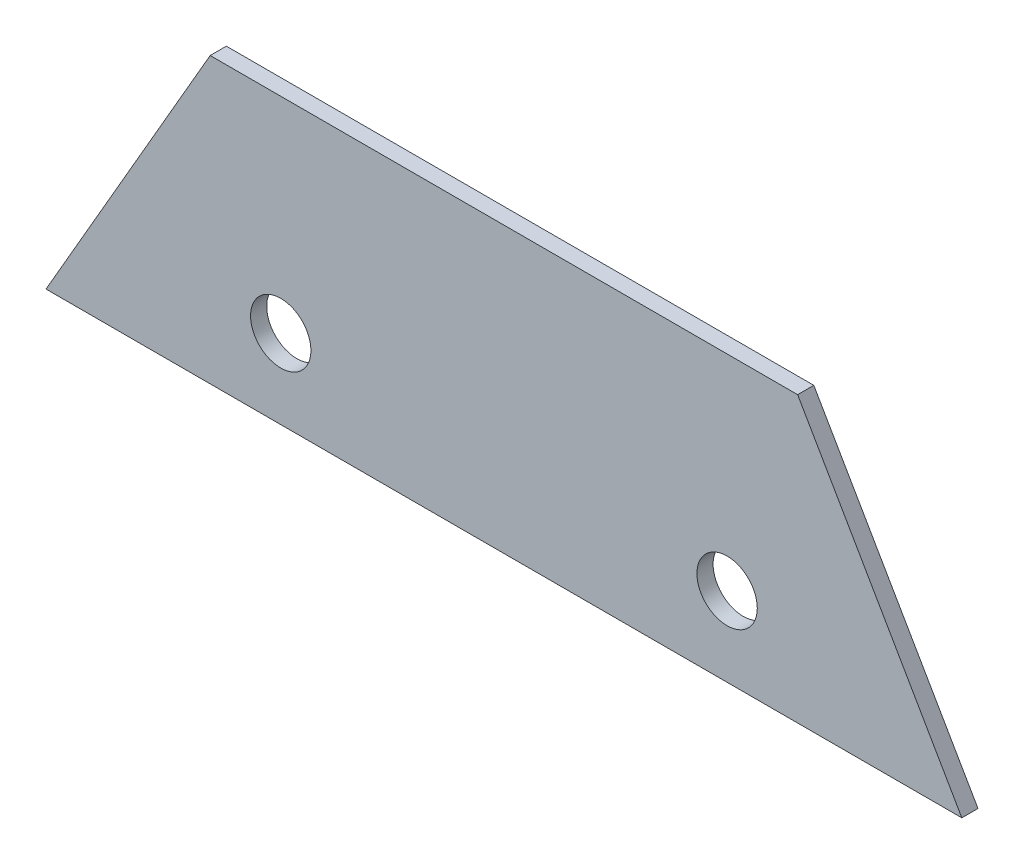
ISO-10303-21;
HEADER;
FILE_DESCRIPTION(('STEP AP214'),'2;1');
FILE_NAME('part.step','',(''),(''),'','','');
FILE_SCHEMA(('AUTOMOTIVE_DESIGN { 1 0 10303 214 1 1 1 1 }'));
ENDSEC;
DATA;
#1=APPLICATION_CONTEXT('core data for automotive mechanical design processes');
#2=APPLICATION_PROTOCOL_DEFINITION('international standard','automotive_design',2000,#1);
#3=PRODUCT_CONTEXT('',#1,'mechanical');
#4=PRODUCT('Part','Part','',(#3));
#5=PRODUCT_RELATED_PRODUCT_CATEGORY('part','',(#4));
#6=PRODUCT_DEFINITION_FORMATION('','',#4);
#7=PRODUCT_DEFINITION_CONTEXT('part definition',#1,'design');
#8=PRODUCT_DEFINITION('design','',#6,#7);
#9=PRODUCT_DEFINITION_SHAPE('','',#8);
#10=(LENGTH_UNIT() NAMED_UNIT(*) SI_UNIT(.MILLI.,.METRE.));
#11=(NAMED_UNIT(*) PLANE_ANGLE_UNIT() SI_UNIT($,.RADIAN.));
#12=(NAMED_UNIT(*) SI_UNIT($,.STERADIAN.) SOLID_ANGLE_UNIT());
#13=UNCERTAINTY_MEASURE_WITH_UNIT(LENGTH_MEASURE(1.E-05),#10,'distance_accuracy_value','');
#14=(GEOMETRIC_REPRESENTATION_CONTEXT(3) GLOBAL_UNCERTAINTY_ASSIGNED_CONTEXT((#13)) GLOBAL_UNIT_ASSIGNED_CONTEXT((#10,
#11,#12)) REPRESENTATION_CONTEXT('',''));
#15=CARTESIAN_POINT('',(0.,0.,0.));
#16=DIRECTION('',(0.,0.,1.));
#17=DIRECTION('',(1.,0.,0.));
#18=AXIS2_PLACEMENT_3D('',#15,#16,#17);
#19=CARTESIAN_POINT('',(0.,0.,-11.90625));
#20=DIRECTION('',(0.,0.,-1.));
#21=DIRECTION('',(0.,1.,0.));
#22=AXIS2_PLACEMENT_3D('',#19,#20,#21);
#23=PLANE('',#22);
#24=CARTESIAN_POINT('',(-164.309496882,-525.607187924995,-11.90625));
#25=DIRECTION('',(0.,0.,1.));
#26=DIRECTION('',(1.,0.,0.));
#27=AXIS2_PLACEMENT_3D('',#24,#25,#26);
#28=CIRCLE('',#27,22.225);
#29=CARTESIAN_POINT('',(-142.084496882,-525.607187924995,-11.90625));
#30=VERTEX_POINT('',#29);
#31=EDGE_CURVE('E101',#30,#30,#28,.T.);
#32=ORIENTED_EDGE('',*,*,#31,.T.);
#33=EDGE_LOOP('',(#32));
#34=FACE_BOUND('',#33,.T.);
#35=CARTESIAN_POINT('',(164.309496882,-525.607187924995,-11.90625));
#36=DIRECTION('',(0.,0.,1.));
#37=DIRECTION('',(1.,0.,0.));
#38=AXIS2_PLACEMENT_3D('',#35,#36,#37);
#39=CIRCLE('',#38,22.225);
#40=CARTESIAN_POINT('',(186.534496882,-525.607187924995,-11.90625));
#41=VERTEX_POINT('',#40);
#42=EDGE_CURVE('E119',#41,#41,#39,.T.);
#43=ORIENTED_EDGE('',*,*,#42,.T.);
#44=EDGE_LOOP('',(#43));
#45=FACE_BOUND('',#44,.T.);
#46=DIRECTION('',(1.,0.,0.));
#47=VECTOR('',#46,1.);
#48=CARTESIAN_POINT('',(337.114930678369,-583.900187924995,-11.90625));
#49=LINE('',#48,#47);
#50=CARTESIAN_POINT('',(-337.114930678359,-583.900187924995,-11.90625));
#51=VERTEX_POINT('',#50);
#52=CARTESIAN_POINT('',(337.114930678369,-583.900187924995,-11.90625));
#53=VERTEX_POINT('',#52);
#54=EDGE_CURVE('E47',#51,#53,#49,.T.);
#55=ORIENTED_EDGE('',*,*,#54,.F.);
#56=DIRECTION('',(-0.5,-0.866025403784439,0.));
#57=VECTOR('',#56,1.);
#58=CARTESIAN_POINT('',(-337.114930678359,-583.900187924995,-11.90625));
#59=LINE('',#58,#57);
#60=CARTESIAN_POINT('',(-216.238948080681,-374.536844651005,-11.90625));
#61=VERTEX_POINT('',#60);
#62=EDGE_CURVE('E70',#61,#51,#59,.T.);
#63=ORIENTED_EDGE('',*,*,#62,.F.);
#64=DIRECTION('',(-1.,0.,0.));
#65=VECTOR('',#64,1.);
#66=CARTESIAN_POINT('',(-216.238948080681,-374.536844651005,-11.90625));
#67=LINE('',#66,#65);
#68=CARTESIAN_POINT('',(216.238948080691,-374.536844651005,-11.90625));
#69=VERTEX_POINT('',#68);
#70=EDGE_CURVE('E75',#69,#61,#67,.T.);
#71=ORIENTED_EDGE('',*,*,#70,.F.);
#72=DIRECTION('',(-0.5,0.866025403784438,0.));
#73=VECTOR('',#72,1.);
#74=CARTESIAN_POINT('',(216.238948080691,-374.536844651005,-11.90625));
#75=LINE('',#74,#73);
#76=EDGE_CURVE('E90',#53,#69,#75,.T.);
#77=ORIENTED_EDGE('',*,*,#76,.F.);
#78=EDGE_LOOP('',(#55,#63,#71,#77));
#79=FACE_BOUND('',#78,.T.);
#80=ADVANCED_FACE('F39',(#34,#45,#79),#23,.T.);
#81=CARTESIAN_POINT('',(0.,0.,0.));
#82=DIRECTION('',(0.,0.,-1.));
#83=DIRECTION('',(-1.,0.,0.));
#84=AXIS2_PLACEMENT_3D('',#81,#82,#83);
#85=PLANE('',#84);
#86=CARTESIAN_POINT('',(-164.309496882,-525.607187924995,0.));
#87=DIRECTION('',(0.,0.,1.));
#88=DIRECTION('',(1.,0.,0.));
#89=AXIS2_PLACEMENT_3D('',#86,#87,#88);
#90=CIRCLE('',#89,22.225);
#91=CARTESIAN_POINT('',(-142.084496882,-525.607187924995,0.));
#92=VERTEX_POINT('',#91);
#93=EDGE_CURVE('E122',#92,#92,#90,.T.);
#94=ORIENTED_EDGE('',*,*,#93,.F.);
#95=EDGE_LOOP('',(#94));
#96=FACE_BOUND('',#95,.T.);
#97=CARTESIAN_POINT('',(164.309496882,-525.607187924995,0.));
#98=DIRECTION('',(0.,0.,1.));
#99=DIRECTION('',(1.,0.,0.));
#100=AXIS2_PLACEMENT_3D('',#97,#98,#99);
#101=CIRCLE('',#100,22.225);
#102=CARTESIAN_POINT('',(186.534496882,-525.607187924995,0.));
#103=VERTEX_POINT('',#102);
#104=EDGE_CURVE('E116',#103,#103,#101,.T.);
#105=ORIENTED_EDGE('',*,*,#104,.F.);
#106=EDGE_LOOP('',(#105));
#107=FACE_BOUND('',#106,.T.);
#108=DIRECTION('',(1.,0.,0.));
#109=VECTOR('',#108,1.);
#110=CARTESIAN_POINT('',(337.114930678369,-583.900187924995,0.));
#111=LINE('',#110,#109);
#112=CARTESIAN_POINT('',(-337.114930678359,-583.900187924995,0.));
#113=VERTEX_POINT('',#112);
#114=CARTESIAN_POINT('',(337.114930678369,-583.900187924995,0.));
#115=VERTEX_POINT('',#114);
#116=EDGE_CURVE('E99',#113,#115,#111,.T.);
#117=ORIENTED_EDGE('',*,*,#116,.T.);
#118=DIRECTION('',(-0.5,0.866025403784438,0.));
#119=VECTOR('',#118,1.);
#120=CARTESIAN_POINT('',(216.238948080691,-374.536844651005,0.));
#121=LINE('',#120,#119);
#122=CARTESIAN_POINT('',(216.238948080691,-374.536844651005,0.));
#123=VERTEX_POINT('',#122);
#124=EDGE_CURVE('E88',#115,#123,#121,.T.);
#125=ORIENTED_EDGE('',*,*,#124,.T.);
#126=DIRECTION('',(-1.,0.,0.));
#127=VECTOR('',#126,1.);
#128=CARTESIAN_POINT('',(-216.238948080681,-374.536844651005,0.));
#129=LINE('',#128,#127);
#130=CARTESIAN_POINT('',(-216.238948080681,-374.536844651005,0.));
#131=VERTEX_POINT('',#130);
#132=EDGE_CURVE('E91',#123,#131,#129,.T.);
#133=ORIENTED_EDGE('',*,*,#132,.T.);
#134=DIRECTION('',(-0.5,-0.866025403784439,0.));
#135=VECTOR('',#134,1.);
#136=CARTESIAN_POINT('',(-337.114930678359,-583.900187924995,0.));
#137=LINE('',#136,#135);
#138=EDGE_CURVE('E96',#131,#113,#137,.T.);
#139=ORIENTED_EDGE('',*,*,#138,.T.);
#140=EDGE_LOOP('',(#117,#125,#133,#139));
#141=FACE_BOUND('',#140,.T.);
#142=ADVANCED_FACE('F98',(#96,#107,#141),#85,.F.);
#143=CARTESIAN_POINT('',(216.238948080691,-374.536844651005,-717.894150358055));
#144=DIRECTION('',(0.866025403784438,0.5,0.));
#145=DIRECTION('',(-0.5,0.866025403784438,0.));
#146=AXIS2_PLACEMENT_3D('',#143,#144,#145);
#147=PLANE('',#146);
#148=DIRECTION('',(0.,0.,1.));
#149=VECTOR('',#148,1.);
#150=CARTESIAN_POINT('',(337.114930678369,-583.900187924995,-717.894150358055));
#151=LINE('',#150,#149);
#152=EDGE_CURVE('E11',#53,#115,#151,.T.);
#153=ORIENTED_EDGE('',*,*,#152,.F.);
#154=ORIENTED_EDGE('',*,*,#76,.T.);
#155=DIRECTION('',(0.,0.,1.));
#156=VECTOR('',#155,1.);
#157=CARTESIAN_POINT('',(216.238948080691,-374.536844651005,-717.894150358055));
#158=LINE('',#157,#156);
#159=EDGE_CURVE('E85',#69,#123,#158,.T.);
#160=ORIENTED_EDGE('',*,*,#159,.T.);
#161=ORIENTED_EDGE('',*,*,#124,.F.);
#162=EDGE_LOOP('',(#153,#154,#160,#161));
#163=FACE_BOUND('',#162,.T.);
#164=ADVANCED_FACE('F86',(#163),#147,.T.);
#165=CARTESIAN_POINT('',(-216.238948080681,-374.536844651005,-717.894150358055));
#166=DIRECTION('',(0.,1.,0.));
#167=DIRECTION('',(-1.,0.,0.));
#168=AXIS2_PLACEMENT_3D('',#165,#166,#167);
#169=PLANE('',#168);
#170=ORIENTED_EDGE('',*,*,#159,.F.);
#171=ORIENTED_EDGE('',*,*,#70,.T.);
#172=DIRECTION('',(0.,0.,1.));
#173=VECTOR('',#172,1.);
#174=CARTESIAN_POINT('',(-216.238948080681,-374.536844651005,-717.894150358055));
#175=LINE('',#174,#173);
#176=EDGE_CURVE('E80',#61,#131,#175,.T.);
#177=ORIENTED_EDGE('',*,*,#176,.T.);
#178=ORIENTED_EDGE('',*,*,#132,.F.);
#179=EDGE_LOOP('',(#170,#171,#177,#178));
#180=FACE_BOUND('',#179,.T.);
#181=ADVANCED_FACE('F92',(#180),#169,.T.);
#182=CARTESIAN_POINT('',(-337.114930678359,-583.900187924995,-717.894150358055));
#183=DIRECTION('',(-0.866025403784439,0.5,0.));
#184=DIRECTION('',(-0.5,-0.866025403784439,0.));
#185=AXIS2_PLACEMENT_3D('',#182,#183,#184);
#186=PLANE('',#185);
#187=ORIENTED_EDGE('',*,*,#176,.F.);
#188=ORIENTED_EDGE('',*,*,#62,.T.);
#189=DIRECTION('',(0.,0.,1.));
#190=VECTOR('',#189,1.);
#191=CARTESIAN_POINT('',(-337.114930678359,-583.900187924995,-717.894150358055));
#192=LINE('',#191,#190);
#193=EDGE_CURVE('E107',#51,#113,#192,.T.);
#194=ORIENTED_EDGE('',*,*,#193,.T.);
#195=ORIENTED_EDGE('',*,*,#138,.F.);
#196=EDGE_LOOP('',(#187,#188,#194,#195));
#197=FACE_BOUND('',#196,.T.);
#198=ADVANCED_FACE('F113',(#197),#186,.T.);
#199=CARTESIAN_POINT('',(337.114930678369,-583.900187924995,-717.894150358055));
#200=DIRECTION('',(0.,-1.,0.));
#201=DIRECTION('',(1.,0.,0.));
#202=AXIS2_PLACEMENT_3D('',#199,#200,#201);
#203=PLANE('',#202);
#204=ORIENTED_EDGE('',*,*,#193,.F.);
#205=ORIENTED_EDGE('',*,*,#54,.T.);
#206=ORIENTED_EDGE('',*,*,#152,.T.);
#207=ORIENTED_EDGE('',*,*,#116,.F.);
#208=EDGE_LOOP('',(#204,#205,#206,#207));
#209=FACE_BOUND('',#208,.T.);
#210=ADVANCED_FACE('F114',(#209),#203,.T.);
#211=CARTESIAN_POINT('',(164.309496882,-525.607187924995,-11.90625));
#212=DIRECTION('',(0.,0.,1.));
#213=DIRECTION('',(1.,0.,0.));
#214=AXIS2_PLACEMENT_3D('',#211,#212,#213);
#215=CYLINDRICAL_SURFACE('',#214,22.225);
#216=ORIENTED_EDGE('',*,*,#42,.F.);
#217=EDGE_LOOP('',(#216));
#218=FACE_BOUND('',#217,.T.);
#219=ORIENTED_EDGE('',*,*,#104,.T.);
#220=EDGE_LOOP('',(#219));
#221=FACE_BOUND('',#220,.T.);
#222=ADVANCED_FACE('F133',(#218,#221),#215,.F.);
#223=CARTESIAN_POINT('',(-164.309496882,-525.607187924995,-11.90625));
#224=DIRECTION('',(0.,0.,1.));
#225=DIRECTION('',(1.,0.,0.));
#226=AXIS2_PLACEMENT_3D('',#223,#224,#225);
#227=CYLINDRICAL_SURFACE('',#226,22.225);
#228=ORIENTED_EDGE('',*,*,#31,.F.);
#229=EDGE_LOOP('',(#228));
#230=FACE_BOUND('',#229,.T.);
#231=ORIENTED_EDGE('',*,*,#93,.T.);
#232=EDGE_LOOP('',(#231));
#233=FACE_BOUND('',#232,.T.);
#234=ADVANCED_FACE('F130',(#230,#233),#227,.F.);
#235=CLOSED_SHELL('',(#80,#142,#164,#181,#198,#210,#222,#234));
#236=MANIFOLD_SOLID_BREP('B2',#235);
#237=ADVANCED_BREP_SHAPE_REPRESENTATION('',(#18,#236),#14);
#238=SHAPE_DEFINITION_REPRESENTATION(#9,#237);
ENDSEC;
END-ISO-10303-21;
